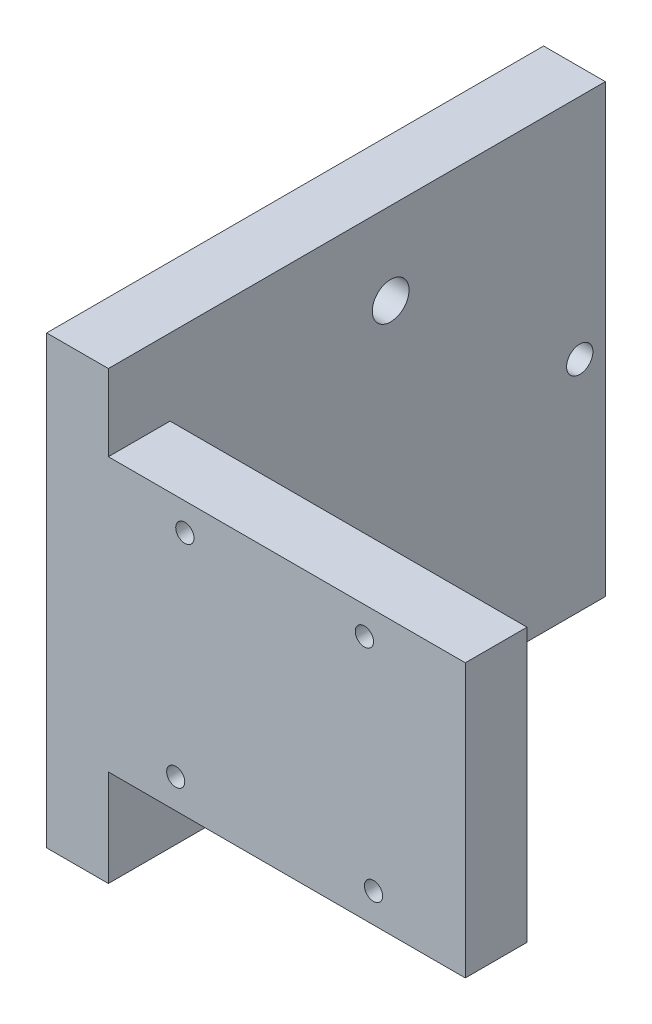
ISO-10303-21;
HEADER;
FILE_DESCRIPTION(('STEP AP214'),'2;1');
FILE_NAME('part.step','',(''),(''),'','','');
FILE_SCHEMA(('AUTOMOTIVE_DESIGN { 1 0 10303 214 1 1 1 1 }'));
ENDSEC;
DATA;
#1=APPLICATION_CONTEXT('core data for automotive mechanical design processes');
#2=APPLICATION_PROTOCOL_DEFINITION('international standard','automotive_design',2000,#1);
#3=PRODUCT_CONTEXT('',#1,'mechanical');
#4=PRODUCT('Part','Part','',(#3));
#5=PRODUCT_RELATED_PRODUCT_CATEGORY('part','',(#4));
#6=PRODUCT_DEFINITION_FORMATION('','',#4);
#7=PRODUCT_DEFINITION_CONTEXT('part definition',#1,'design');
#8=PRODUCT_DEFINITION('design','',#6,#7);
#9=PRODUCT_DEFINITION_SHAPE('','',#8);
#10=(LENGTH_UNIT() NAMED_UNIT(*) SI_UNIT(.MILLI.,.METRE.));
#11=(NAMED_UNIT(*) PLANE_ANGLE_UNIT() SI_UNIT($,.RADIAN.));
#12=(NAMED_UNIT(*) SI_UNIT($,.STERADIAN.) SOLID_ANGLE_UNIT());
#13=UNCERTAINTY_MEASURE_WITH_UNIT(LENGTH_MEASURE(1.E-05),#10,'distance_accuracy_value','');
#14=(GEOMETRIC_REPRESENTATION_CONTEXT(3) GLOBAL_UNCERTAINTY_ASSIGNED_CONTEXT((#13)) GLOBAL_UNIT_ASSIGNED_CONTEXT((#10,
#11,#12)) REPRESENTATION_CONTEXT('',''));
#15=CARTESIAN_POINT('',(0.,0.,0.));
#16=DIRECTION('',(0.,0.,1.));
#17=DIRECTION('',(1.,0.,0.));
#18=AXIS2_PLACEMENT_3D('',#15,#16,#17);
#19=CARTESIAN_POINT('',(0.,22.,24.5124364563846));
#20=DIRECTION('',(0.,0.,-1.));
#21=DIRECTION('',(-1.,0.,0.));
#22=AXIS2_PLACEMENT_3D('',#19,#20,#21);
#23=PLANE('',#22);
#24=CARTESIAN_POINT('',(3.32185507699023,6.22355655064786,24.5124364563846));
#25=DIRECTION('',(0.,0.,1.));
#26=DIRECTION('',(1.,0.,0.));
#27=AXIS2_PLACEMENT_3D('',#24,#25,#26);
#28=CIRCLE('',#27,0.44585595260604);
#29=CARTESIAN_POINT('',(3.76771102959627,6.22355655064786,24.5124364563846));
#30=VERTEX_POINT('',#29);
#31=EDGE_CURVE('E189',#30,#30,#28,.T.);
#32=ORIENTED_EDGE('',*,*,#31,.F.);
#33=EDGE_LOOP('',(#32));
#34=FACE_BOUND('',#33,.T.);
#35=CARTESIAN_POINT('',(13.0789049854493,6.22355655064786,24.5124364563846));
#36=DIRECTION('',(0.,0.,1.));
#37=DIRECTION('',(1.,0.,0.));
#38=AXIS2_PLACEMENT_3D('',#35,#36,#37);
#39=CIRCLE('',#38,0.449707116052006);
#40=CARTESIAN_POINT('',(13.5286121015013,6.22355655064786,24.5124364563846));
#41=VERTEX_POINT('',#40);
#42=EDGE_CURVE('E195',#41,#41,#39,.T.);
#43=ORIENTED_EDGE('',*,*,#42,.F.);
#44=EDGE_LOOP('',(#43));
#45=FACE_BOUND('',#44,.T.);
#46=CARTESIAN_POINT('',(12.6280672922064,16.868201952061,24.5124364563846));
#47=DIRECTION('',(0.,0.,1.));
#48=DIRECTION('',(1.,0.,0.));
#49=AXIS2_PLACEMENT_3D('',#46,#47,#48);
#50=CIRCLE('',#49,0.45083769324284);
#51=CARTESIAN_POINT('',(13.0789049854493,16.868201952061,24.5124364563846));
#52=VERTEX_POINT('',#51);
#53=EDGE_CURVE('E190',#52,#52,#50,.T.);
#54=ORIENTED_EDGE('',*,*,#53,.F.);
#55=EDGE_LOOP('',(#54));
#56=FACE_BOUND('',#55,.T.);
#57=CARTESIAN_POINT('',(3.77269277023307,16.868201952061,24.5124364563846));
#58=DIRECTION('',(0.,0.,1.));
#59=DIRECTION('',(1.,0.,0.));
#60=AXIS2_PLACEMENT_3D('',#57,#58,#59);
#61=CIRCLE('',#60,0.450837693242839);
#62=CARTESIAN_POINT('',(4.22353046347591,16.868201952061,24.5124364563846));
#63=VERTEX_POINT('',#62);
#64=EDGE_CURVE('E194',#63,#63,#61,.T.);
#65=ORIENTED_EDGE('',*,*,#64,.F.);
#66=EDGE_LOOP('',(#65));
#67=FACE_BOUND('',#66,.T.);
#68=DIRECTION('',(0.,-1.,0.));
#69=VECTOR('',#68,1.);
#70=CARTESIAN_POINT('',(0.,22.,24.5124364563846));
#71=LINE('',#70,#69);
#72=CARTESIAN_POINT('',(0.,22.,24.5124364563846));
#73=VERTEX_POINT('',#72);
#74=CARTESIAN_POINT('',(0.,18.2329000804475,24.5124364563846));
#75=VERTEX_POINT('',#74);
#76=EDGE_CURVE('E136',#73,#75,#71,.T.);
#77=ORIENTED_EDGE('',*,*,#76,.F.);
#78=DIRECTION('',(1.,0.,0.));
#79=VECTOR('',#78,1.);
#80=CARTESIAN_POINT('',(0.,22.,24.5124364563846));
#81=LINE('',#80,#79);
#82=CARTESIAN_POINT('',(-3.04359194622278,22.,24.5124364563846));
#83=VERTEX_POINT('',#82);
#84=EDGE_CURVE('E259',#83,#73,#81,.T.);
#85=ORIENTED_EDGE('',*,*,#84,.F.);
#86=DIRECTION('',(0.,-1.,0.));
#87=VECTOR('',#86,1.);
#88=CARTESIAN_POINT('',(-3.04359194622278,22.,24.5124364563846));
#89=LINE('',#88,#87);
#90=CARTESIAN_POINT('',(-3.04359194622278,0.,24.5124364563846));
#91=VERTEX_POINT('',#90);
#92=EDGE_CURVE('E272',#83,#91,#89,.T.);
#93=ORIENTED_EDGE('',*,*,#92,.T.);
#94=DIRECTION('',(1.,0.,0.));
#95=VECTOR('',#94,1.);
#96=CARTESIAN_POINT('',(0.,0.,24.5124364563846));
#97=LINE('',#96,#95);
#98=CARTESIAN_POINT('',(0.,0.,24.5124364563846));
#99=VERTEX_POINT('',#98);
#100=EDGE_CURVE('E210',#91,#99,#97,.T.);
#101=ORIENTED_EDGE('',*,*,#100,.T.);
#102=DIRECTION('',(0.,-1.,0.));
#103=VECTOR('',#102,1.);
#104=CARTESIAN_POINT('',(0.,0.,24.5124364563846));
#105=LINE('',#104,#103);
#106=CARTESIAN_POINT('',(0.,4.76787854703597,24.5124364563846));
#107=VERTEX_POINT('',#106);
#108=EDGE_CURVE('E152',#107,#99,#105,.T.);
#109=ORIENTED_EDGE('',*,*,#108,.F.);
#110=DIRECTION('',(-1.,0.,0.));
#111=VECTOR('',#110,1.);
#112=CARTESIAN_POINT('',(0.,4.76787854703597,24.5124364563846));
#113=LINE('',#112,#111);
#114=CARTESIAN_POINT('',(17.6060455626506,4.76787854703597,24.5124364563846));
#115=VERTEX_POINT('',#114);
#116=EDGE_CURVE('E179',#115,#107,#113,.T.);
#117=ORIENTED_EDGE('',*,*,#116,.F.);
#118=DIRECTION('',(0.,-1.,0.));
#119=VECTOR('',#118,1.);
#120=CARTESIAN_POINT('',(17.6060455626506,22.,24.5124364563846));
#121=LINE('',#120,#119);
#122=CARTESIAN_POINT('',(17.6060455626506,18.2329000804475,24.5124364563846));
#123=VERTEX_POINT('',#122);
#124=EDGE_CURVE('E166',#123,#115,#121,.T.);
#125=ORIENTED_EDGE('',*,*,#124,.F.);
#126=DIRECTION('',(1.,0.,0.));
#127=VECTOR('',#126,1.);
#128=CARTESIAN_POINT('',(0.,18.2329000804475,24.5124364563846));
#129=LINE('',#128,#127);
#130=EDGE_CURVE('E151',#75,#123,#129,.T.);
#131=ORIENTED_EDGE('',*,*,#130,.F.);
#132=EDGE_LOOP('',(#77,#85,#93,#101,#109,#117,#125,#131));
#133=FACE_BOUND('',#132,.T.);
#134=ADVANCED_FACE('F45',(#34,#45,#56,#67,#133),#23,.F.);
#135=CARTESIAN_POINT('',(17.6060455626506,22.,21.4688445101618));
#136=DIRECTION('',(1.,0.,0.));
#137=DIRECTION('',(0.,0.,-1.));
#138=AXIS2_PLACEMENT_3D('',#135,#136,#137);
#139=PLANE('',#138);
#140=DIRECTION('',(0.,-1.,0.));
#141=VECTOR('',#140,1.);
#142=CARTESIAN_POINT('',(17.6060455626506,22.,21.4688445101618));
#143=LINE('',#142,#141);
#144=CARTESIAN_POINT('',(17.6060455626506,18.2329000804475,21.4688445101618));
#145=VERTEX_POINT('',#144);
#146=CARTESIAN_POINT('',(17.6060455626506,4.76787854703597,21.4688445101618));
#147=VERTEX_POINT('',#146);
#148=EDGE_CURVE('E300',#145,#147,#143,.T.);
#149=ORIENTED_EDGE('',*,*,#148,.F.);
#150=DIRECTION('',(0.,0.,-1.));
#151=VECTOR('',#150,1.);
#152=CARTESIAN_POINT('',(17.6060455626506,18.2329000804475,24.5124364563846));
#153=LINE('',#152,#151);
#154=EDGE_CURVE('E161',#123,#145,#153,.T.);
#155=ORIENTED_EDGE('',*,*,#154,.F.);
#156=ORIENTED_EDGE('',*,*,#124,.T.);
#157=DIRECTION('',(0.,0.,-1.));
#158=VECTOR('',#157,1.);
#159=CARTESIAN_POINT('',(17.6060455626506,4.76787854703597,24.5124364563846));
#160=LINE('',#159,#158);
#161=EDGE_CURVE('E172',#115,#147,#160,.T.);
#162=ORIENTED_EDGE('',*,*,#161,.T.);
#163=EDGE_LOOP('',(#149,#155,#156,#162));
#164=FACE_BOUND('',#163,.T.);
#165=ADVANCED_FACE('F335',(#164),#139,.T.);
#166=CARTESIAN_POINT('',(0.,22.,21.4688445101618));
#167=DIRECTION('',(0.,0.,-1.));
#168=DIRECTION('',(-1.,0.,0.));
#169=AXIS2_PLACEMENT_3D('',#166,#167,#168);
#170=PLANE('',#169);
#171=CARTESIAN_POINT('',(3.32185507699023,6.22355655064786,21.4688445101618));
#172=DIRECTION('',(0.,0.,-1.));
#173=DIRECTION('',(-1.,0.,0.));
#174=AXIS2_PLACEMENT_3D('',#171,#172,#173);
#175=CIRCLE('',#174,0.44585595260604);
#176=CARTESIAN_POINT('',(2.87599912438419,6.22355655064786,21.4688445101618));
#177=VERTEX_POINT('',#176);
#178=EDGE_CURVE('E48',#177,#177,#175,.F.);
#179=ORIENTED_EDGE('',*,*,#178,.T.);
#180=EDGE_LOOP('',(#179));
#181=FACE_BOUND('',#180,.T.);
#182=CARTESIAN_POINT('',(13.0789049854493,6.22355655064786,21.4688445101618));
#183=DIRECTION('',(0.,0.,-1.));
#184=DIRECTION('',(-1.,0.,0.));
#185=AXIS2_PLACEMENT_3D('',#182,#183,#184);
#186=CIRCLE('',#185,0.449707116052006);
#187=CARTESIAN_POINT('',(12.6291978693972,6.22355655064786,21.4688445101618));
#188=VERTEX_POINT('',#187);
#189=EDGE_CURVE('E314',#188,#188,#186,.F.);
#190=ORIENTED_EDGE('',*,*,#189,.T.);
#191=EDGE_LOOP('',(#190));
#192=FACE_BOUND('',#191,.T.);
#193=CARTESIAN_POINT('',(12.6280672922064,16.868201952061,21.4688445101618));
#194=DIRECTION('',(0.,0.,-1.));
#195=DIRECTION('',(-1.,0.,0.));
#196=AXIS2_PLACEMENT_3D('',#193,#194,#195);
#197=CIRCLE('',#196,0.45083769324284);
#198=CARTESIAN_POINT('',(12.1772295989636,16.868201952061,21.4688445101618));
#199=VERTEX_POINT('',#198);
#200=EDGE_CURVE('E311',#199,#199,#197,.F.);
#201=ORIENTED_EDGE('',*,*,#200,.T.);
#202=EDGE_LOOP('',(#201));
#203=FACE_BOUND('',#202,.T.);
#204=CARTESIAN_POINT('',(3.77269277023307,16.868201952061,21.4688445101618));
#205=DIRECTION('',(0.,0.,-1.));
#206=DIRECTION('',(-1.,0.,0.));
#207=AXIS2_PLACEMENT_3D('',#204,#205,#206);
#208=CIRCLE('',#207,0.450837693242839);
#209=CARTESIAN_POINT('',(3.32185507699023,16.868201952061,21.4688445101618));
#210=VERTEX_POINT('',#209);
#211=EDGE_CURVE('E205',#210,#210,#208,.F.);
#212=ORIENTED_EDGE('',*,*,#211,.T.);
#213=EDGE_LOOP('',(#212));
#214=FACE_BOUND('',#213,.T.);
#215=DIRECTION('',(0.,-1.,0.));
#216=VECTOR('',#215,1.);
#217=CARTESIAN_POINT('',(0.,22.,21.4688445101618));
#218=LINE('',#217,#216);
#219=CARTESIAN_POINT('',(0.,18.2329000804475,21.4688445101618));
#220=VERTEX_POINT('',#219);
#221=CARTESIAN_POINT('',(0.,4.76787854703597,21.4688445101618));
#222=VERTEX_POINT('',#221);
#223=EDGE_CURVE('E297',#220,#222,#218,.T.);
#224=ORIENTED_EDGE('',*,*,#223,.F.);
#225=DIRECTION('',(1.,0.,0.));
#226=VECTOR('',#225,1.);
#227=CARTESIAN_POINT('',(0.,18.2329000804475,21.4688445101618));
#228=LINE('',#227,#226);
#229=EDGE_CURVE('E158',#220,#145,#228,.T.);
#230=ORIENTED_EDGE('',*,*,#229,.T.);
#231=ORIENTED_EDGE('',*,*,#148,.T.);
#232=DIRECTION('',(-1.,0.,0.));
#233=VECTOR('',#232,1.);
#234=CARTESIAN_POINT('',(0.,4.76787854703597,21.4688445101618));
#235=LINE('',#234,#233);
#236=EDGE_CURVE('E160',#147,#222,#235,.T.);
#237=ORIENTED_EDGE('',*,*,#236,.T.);
#238=EDGE_LOOP('',(#224,#230,#231,#237));
#239=FACE_BOUND('',#238,.T.);
#240=ADVANCED_FACE('F323',(#181,#192,#203,#214,#239),#170,.T.);
#241=CARTESIAN_POINT('',(0.,22.,0.));
#242=DIRECTION('',(0.,-1.,0.));
#243=DIRECTION('',(-1.,0.,0.));
#244=AXIS2_PLACEMENT_3D('',#241,#242,#243);
#245=PLANE('',#244);
#246=ORIENTED_EDGE('',*,*,#84,.T.);
#247=DIRECTION('',(0.,0.,1.));
#248=VECTOR('',#247,1.);
#249=CARTESIAN_POINT('',(0.,22.,0.));
#250=LINE('',#249,#248);
#251=CARTESIAN_POINT('',(0.,22.,0.));
#252=VERTEX_POINT('',#251);
#253=EDGE_CURVE('E145',#252,#73,#250,.T.);
#254=ORIENTED_EDGE('',*,*,#253,.F.);
#255=DIRECTION('',(1.,0.,0.));
#256=VECTOR('',#255,1.);
#257=CARTESIAN_POINT('',(-3.04359194622278,22.,0.));
#258=LINE('',#257,#256);
#259=CARTESIAN_POINT('',(-3.04359194622278,22.,0.));
#260=VERTEX_POINT('',#259);
#261=EDGE_CURVE('E265',#260,#252,#258,.T.);
#262=ORIENTED_EDGE('',*,*,#261,.F.);
#263=DIRECTION('',(0.,0.,-1.));
#264=VECTOR('',#263,1.);
#265=CARTESIAN_POINT('',(-3.04359194622278,22.,0.));
#266=LINE('',#265,#264);
#267=EDGE_CURVE('E269',#260,#83,#266,.F.);
#268=ORIENTED_EDGE('',*,*,#267,.T.);
#269=EDGE_LOOP('',(#246,#254,#262,#268));
#270=FACE_BOUND('',#269,.T.);
#271=ADVANCED_FACE('F379',(#270),#245,.F.);
#272=CARTESIAN_POINT('',(0.,0.,0.));
#273=DIRECTION('',(0.,-1.,0.));
#274=DIRECTION('',(-1.,0.,0.));
#275=AXIS2_PLACEMENT_3D('',#272,#273,#274);
#276=PLANE('',#275);
#277=DIRECTION('',(0.,0.,1.));
#278=VECTOR('',#277,1.);
#279=CARTESIAN_POINT('',(0.,0.,0.));
#280=LINE('',#279,#278);
#281=CARTESIAN_POINT('',(0.,0.,13.1074752296887));
#282=VERTEX_POINT('',#281);
#283=EDGE_CURVE('E62',#282,#99,#280,.T.);
#284=ORIENTED_EDGE('',*,*,#283,.T.);
#285=ORIENTED_EDGE('',*,*,#100,.F.);
#286=DIRECTION('',(0.,0.,-1.));
#287=VECTOR('',#286,1.);
#288=CARTESIAN_POINT('',(-3.04359194622278,0.,0.));
#289=LINE('',#288,#287);
#290=CARTESIAN_POINT('',(-3.04359194622278,0.,13.1074752296887));
#291=VERTEX_POINT('',#290);
#292=EDGE_CURVE('E284',#291,#91,#289,.F.);
#293=ORIENTED_EDGE('',*,*,#292,.F.);
#294=DIRECTION('',(-1.,0.,0.));
#295=VECTOR('',#294,1.);
#296=CARTESIAN_POINT('',(0.,0.,13.1074752296887));
#297=LINE('',#296,#295);
#298=EDGE_CURVE('E54',#282,#291,#297,.T.);
#299=ORIENTED_EDGE('',*,*,#298,.F.);
#300=EDGE_LOOP('',(#284,#285,#293,#299));
#301=FACE_BOUND('',#300,.T.);
#302=ADVANCED_FACE('F382',(#301),#276,.T.);
#303=DIRECTION('',(1.,0.,0.));
#304=VECTOR('',#303,1.);
#305=CARTESIAN_POINT('',(0.,0.,8.07117179772687));
#306=LINE('',#305,#304);
#307=CARTESIAN_POINT('',(-3.04359194622278,0.,8.07117179772687));
#308=VERTEX_POINT('',#307);
#309=CARTESIAN_POINT('',(0.,0.,8.07117179772687));
#310=VERTEX_POINT('',#309);
#311=EDGE_CURVE('E11',#308,#310,#306,.T.);
#312=ORIENTED_EDGE('',*,*,#311,.F.);
#313=CARTESIAN_POINT('',(-3.04359194622278,0.,0.));
#314=VERTEX_POINT('',#313);
#315=EDGE_CURVE('E262',#314,#308,#289,.F.);
#316=ORIENTED_EDGE('',*,*,#315,.F.);
#317=DIRECTION('',(1.,0.,0.));
#318=VECTOR('',#317,1.);
#319=CARTESIAN_POINT('',(-3.04359194622278,0.,0.));
#320=LINE('',#319,#318);
#321=CARTESIAN_POINT('',(0.,0.,0.));
#322=VERTEX_POINT('',#321);
#323=EDGE_CURVE('E280',#314,#322,#320,.T.);
#324=ORIENTED_EDGE('',*,*,#323,.T.);
#325=EDGE_CURVE('E276',#322,#310,#280,.T.);
#326=ORIENTED_EDGE('',*,*,#325,.T.);
#327=EDGE_LOOP('',(#312,#316,#324,#326));
#328=FACE_BOUND('',#327,.T.);
#329=ADVANCED_FACE('F386',(#328),#276,.T.);
#330=CARTESIAN_POINT('',(0.,22.,0.));
#331=DIRECTION('',(1.,0.,0.));
#332=DIRECTION('',(0.,0.,-1.));
#333=AXIS2_PLACEMENT_3D('',#330,#331,#332);
#334=PLANE('',#333);
#335=CARTESIAN_POINT('',(0.,17.9381550658899,10.5893235137078));
#336=DIRECTION('',(1.,0.,0.));
#337=DIRECTION('',(0.,0.,-1.));
#338=AXIS2_PLACEMENT_3D('',#335,#336,#337);
#339=CIRCLE('',#338,0.906952967008095);
#340=CARTESIAN_POINT('',(0.,17.9381550658899,9.68237054669969));
#341=VERTEX_POINT('',#340);
#342=EDGE_CURVE('E232',#341,#341,#339,.T.);
#343=ORIENTED_EDGE('',*,*,#342,.F.);
#344=EDGE_LOOP('',(#343));
#345=FACE_BOUND('',#344,.T.);
#346=ORIENTED_EDGE('',*,*,#325,.F.);
#347=DIRECTION('',(0.,-1.,0.));
#348=VECTOR('',#347,1.);
#349=CARTESIAN_POINT('',(0.,22.,0.));
#350=LINE('',#349,#348);
#351=EDGE_CURVE('E294',#252,#322,#350,.T.);
#352=ORIENTED_EDGE('',*,*,#351,.F.);
#353=ORIENTED_EDGE('',*,*,#253,.T.);
#354=ORIENTED_EDGE('',*,*,#76,.T.);
#355=DIRECTION('',(0.,0.,-1.));
#356=VECTOR('',#355,1.);
#357=CARTESIAN_POINT('',(0.,18.2329000804475,24.5124364563846));
#358=LINE('',#357,#356);
#359=EDGE_CURVE('E142',#75,#220,#358,.T.);
#360=ORIENTED_EDGE('',*,*,#359,.T.);
#361=ORIENTED_EDGE('',*,*,#223,.T.);
#362=DIRECTION('',(0.,0.,-1.));
#363=VECTOR('',#362,1.);
#364=CARTESIAN_POINT('',(0.,4.76787854703597,24.5124364563846));
#365=LINE('',#364,#363);
#366=EDGE_CURVE('E176',#107,#222,#365,.T.);
#367=ORIENTED_EDGE('',*,*,#366,.F.);
#368=ORIENTED_EDGE('',*,*,#108,.T.);
#369=ORIENTED_EDGE('',*,*,#283,.F.);
#370=DIRECTION('',(0.,-1.,0.));
#371=VECTOR('',#370,1.);
#372=CARTESIAN_POINT('',(0.,3.67860657291708,13.1074752296887));
#373=LINE('',#372,#371);
#374=CARTESIAN_POINT('',(0.,3.67860657291708,13.1074752296887));
#375=VERTEX_POINT('',#374);
#376=EDGE_CURVE('E70',#375,#282,#373,.T.);
#377=ORIENTED_EDGE('',*,*,#376,.F.);
#378=DIRECTION('',(0.,0.,1.));
#379=VECTOR('',#378,1.);
#380=CARTESIAN_POINT('',(0.,3.67860657291708,8.07117179772687));
#381=LINE('',#380,#379);
#382=CARTESIAN_POINT('',(0.,3.67860657291708,8.07117179772687));
#383=VERTEX_POINT('',#382);
#384=EDGE_CURVE('E235',#383,#375,#381,.T.);
#385=ORIENTED_EDGE('',*,*,#384,.F.);
#386=DIRECTION('',(0.,1.,0.));
#387=VECTOR('',#386,1.);
#388=CARTESIAN_POINT('',(0.,3.67860657291708,8.07117179772687));
#389=LINE('',#388,#387);
#390=EDGE_CURVE('E223',#310,#383,#389,.T.);
#391=ORIENTED_EDGE('',*,*,#390,.F.);
#392=EDGE_LOOP('',(#346,#352,#353,#354,#360,#361,#367,#368,#369,#377,#385,#391));
#393=FACE_BOUND('',#392,.T.);
#394=CARTESIAN_POINT('',(0.,10.7716723647862,1.26150112221812));
#395=DIRECTION('',(1.,0.,0.));
#396=DIRECTION('',(0.,0.,-1.));
#397=AXIS2_PLACEMENT_3D('',#394,#395,#396);
#398=CIRCLE('',#397,0.649105381072516);
#399=CARTESIAN_POINT('',(0.,10.7716723647862,0.612395741145607));
#400=VERTEX_POINT('',#399);
#401=EDGE_CURVE('E211',#400,#400,#398,.T.);
#402=ORIENTED_EDGE('',*,*,#401,.F.);
#403=EDGE_LOOP('',(#402));
#404=FACE_BOUND('',#403,.T.);
#405=CARTESIAN_POINT('',(0.,10.7716723647862,20.0110017834768));
#406=DIRECTION('',(1.,0.,0.));
#407=DIRECTION('',(0.,0.,-1.));
#408=AXIS2_PLACEMENT_3D('',#405,#406,#407);
#409=CIRCLE('',#408,0.65234643975808);
#410=CARTESIAN_POINT('',(0.,10.7716723647862,19.3586553437187));
#411=VERTEX_POINT('',#410);
#412=EDGE_CURVE('E215',#411,#411,#409,.T.);
#413=ORIENTED_EDGE('',*,*,#412,.F.);
#414=EDGE_LOOP('',(#413));
#415=FACE_BOUND('',#414,.T.);
#416=ADVANCED_FACE('F139',(#345,#393,#404,#415),#334,.T.);
#417=CARTESIAN_POINT('',(-3.04359194622278,22.,0.));
#418=DIRECTION('',(0.,0.,-1.));
#419=DIRECTION('',(-1.,0.,0.));
#420=AXIS2_PLACEMENT_3D('',#417,#418,#419);
#421=PLANE('',#420);
#422=ORIENTED_EDGE('',*,*,#323,.F.);
#423=DIRECTION('',(0.,-1.,0.));
#424=VECTOR('',#423,1.);
#425=CARTESIAN_POINT('',(-3.04359194622278,22.,0.));
#426=LINE('',#425,#424);
#427=EDGE_CURVE('E291',#260,#314,#426,.T.);
#428=ORIENTED_EDGE('',*,*,#427,.F.);
#429=ORIENTED_EDGE('',*,*,#261,.T.);
#430=ORIENTED_EDGE('',*,*,#351,.T.);
#431=EDGE_LOOP('',(#422,#428,#429,#430));
#432=FACE_BOUND('',#431,.T.);
#433=ADVANCED_FACE('F389',(#432),#421,.T.);
#434=CARTESIAN_POINT('',(-3.04359194622278,22.,0.));
#435=DIRECTION('',(1.,0.,0.));
#436=DIRECTION('',(0.,0.,-1.));
#437=AXIS2_PLACEMENT_3D('',#434,#435,#436);
#438=PLANE('',#437);
#439=CARTESIAN_POINT('',(-3.04359194622278,10.7716723647862,1.26150112221812));
#440=DIRECTION('',(1.,0.,0.));
#441=DIRECTION('',(0.,0.,-1.));
#442=AXIS2_PLACEMENT_3D('',#439,#440,#441);
#443=CIRCLE('',#442,0.649105381072516);
#444=CARTESIAN_POINT('',(-3.04359194622278,10.7716723647862,0.612395741145607));
#445=VERTEX_POINT('',#444);
#446=EDGE_CURVE('E206',#445,#445,#443,.T.);
#447=ORIENTED_EDGE('',*,*,#446,.T.);
#448=EDGE_LOOP('',(#447));
#449=FACE_BOUND('',#448,.T.);
#450=CARTESIAN_POINT('',(-3.04359194622278,10.7716723647862,20.0110017834768));
#451=DIRECTION('',(1.,0.,0.));
#452=DIRECTION('',(0.,0.,-1.));
#453=AXIS2_PLACEMENT_3D('',#450,#451,#452);
#454=CIRCLE('',#453,0.65234643975808);
#455=CARTESIAN_POINT('',(-3.04359194622278,10.7716723647862,19.3586553437187));
#456=VERTEX_POINT('',#455);
#457=EDGE_CURVE('E219',#456,#456,#454,.T.);
#458=ORIENTED_EDGE('',*,*,#457,.T.);
#459=EDGE_LOOP('',(#458));
#460=FACE_BOUND('',#459,.T.);
#461=ORIENTED_EDGE('',*,*,#315,.T.);
#462=DIRECTION('',(0.,1.,0.));
#463=VECTOR('',#462,1.);
#464=CARTESIAN_POINT('',(-3.04359194622278,3.67860657291708,8.07117179772687));
#465=LINE('',#464,#463);
#466=CARTESIAN_POINT('',(-3.04359194622278,3.67860657291708,8.07117179772687));
#467=VERTEX_POINT('',#466);
#468=EDGE_CURVE('E236',#308,#467,#465,.T.);
#469=ORIENTED_EDGE('',*,*,#468,.T.);
#470=DIRECTION('',(0.,0.,1.));
#471=VECTOR('',#470,1.);
#472=CARTESIAN_POINT('',(-3.04359194622278,3.67860657291708,8.07117179772687));
#473=LINE('',#472,#471);
#474=CARTESIAN_POINT('',(-3.04359194622278,3.67860657291708,13.1074752296887));
#475=VERTEX_POINT('',#474);
#476=EDGE_CURVE('E245',#467,#475,#473,.T.);
#477=ORIENTED_EDGE('',*,*,#476,.T.);
#478=DIRECTION('',(0.,-1.,0.));
#479=VECTOR('',#478,1.);
#480=CARTESIAN_POINT('',(-3.04359194622278,3.67860657291708,13.1074752296887));
#481=LINE('',#480,#479);
#482=EDGE_CURVE('E228',#475,#291,#481,.T.);
#483=ORIENTED_EDGE('',*,*,#482,.T.);
#484=ORIENTED_EDGE('',*,*,#292,.T.);
#485=ORIENTED_EDGE('',*,*,#92,.F.);
#486=ORIENTED_EDGE('',*,*,#267,.F.);
#487=ORIENTED_EDGE('',*,*,#427,.T.);
#488=EDGE_LOOP('',(#461,#469,#477,#483,#484,#485,#486,#487));
#489=FACE_BOUND('',#488,.T.);
#490=CARTESIAN_POINT('',(-3.04359194622278,17.9381550658899,10.5893235137078));
#491=DIRECTION('',(1.,0.,0.));
#492=DIRECTION('',(0.,0.,-1.));
#493=AXIS2_PLACEMENT_3D('',#490,#491,#492);
#494=CIRCLE('',#493,0.906952967008095);
#495=CARTESIAN_POINT('',(-3.04359194622278,17.9381550658899,9.68237054669969));
#496=VERTEX_POINT('',#495);
#497=EDGE_CURVE('E255',#496,#496,#494,.T.);
#498=ORIENTED_EDGE('',*,*,#497,.T.);
#499=EDGE_LOOP('',(#498));
#500=FACE_BOUND('',#499,.T.);
#501=ADVANCED_FACE('F368',(#449,#460,#489,#500),#438,.F.);
#502=CARTESIAN_POINT('',(-3.04359194622278,3.67860657291708,8.07117179772687));
#503=DIRECTION('',(0.,0.,-1.));
#504=DIRECTION('',(-1.,0.,0.));
#505=AXIS2_PLACEMENT_3D('',#502,#503,#504);
#506=PLANE('',#505);
#507=ORIENTED_EDGE('',*,*,#311,.T.);
#508=ORIENTED_EDGE('',*,*,#390,.T.);
#509=DIRECTION('',(1.,0.,0.));
#510=VECTOR('',#509,1.);
#511=CARTESIAN_POINT('',(-3.04359194622278,3.67860657291708,8.07117179772687));
#512=LINE('',#511,#510);
#513=EDGE_CURVE('E224',#467,#383,#512,.T.);
#514=ORIENTED_EDGE('',*,*,#513,.F.);
#515=ORIENTED_EDGE('',*,*,#468,.F.);
#516=EDGE_LOOP('',(#507,#508,#514,#515));
#517=FACE_BOUND('',#516,.T.);
#518=ADVANCED_FACE('F364',(#517),#506,.F.);
#519=CARTESIAN_POINT('',(-3.04359194622278,3.67860657291708,13.1074752296887));
#520=DIRECTION('',(0.,0.,1.));
#521=DIRECTION('',(1.,0.,0.));
#522=AXIS2_PLACEMENT_3D('',#519,#520,#521);
#523=PLANE('',#522);
#524=ORIENTED_EDGE('',*,*,#298,.T.);
#525=ORIENTED_EDGE('',*,*,#482,.F.);
#526=DIRECTION('',(1.,0.,0.));
#527=VECTOR('',#526,1.);
#528=CARTESIAN_POINT('',(-3.04359194622278,3.67860657291708,13.1074752296887));
#529=LINE('',#528,#527);
#530=EDGE_CURVE('E229',#475,#375,#529,.T.);
#531=ORIENTED_EDGE('',*,*,#530,.T.);
#532=ORIENTED_EDGE('',*,*,#376,.T.);
#533=EDGE_LOOP('',(#524,#525,#531,#532));
#534=FACE_BOUND('',#533,.T.);
#535=ADVANCED_FACE('F367',(#534),#523,.F.);
#536=CARTESIAN_POINT('',(-3.04359194622278,3.67860657291708,8.07117179772687));
#537=DIRECTION('',(0.,1.,0.));
#538=DIRECTION('',(0.,0.,1.));
#539=AXIS2_PLACEMENT_3D('',#536,#537,#538);
#540=PLANE('',#539);
#541=ORIENTED_EDGE('',*,*,#384,.T.);
#542=ORIENTED_EDGE('',*,*,#530,.F.);
#543=ORIENTED_EDGE('',*,*,#476,.F.);
#544=ORIENTED_EDGE('',*,*,#513,.T.);
#545=EDGE_LOOP('',(#541,#542,#543,#544));
#546=FACE_BOUND('',#545,.T.);
#547=ADVANCED_FACE('F370',(#546),#540,.F.);
#548=CARTESIAN_POINT('',(-3.04359194622278,17.9381550658899,10.5893235137078));
#549=DIRECTION('',(1.,0.,0.));
#550=DIRECTION('',(0.,0.,-1.));
#551=AXIS2_PLACEMENT_3D('',#548,#549,#550);
#552=CYLINDRICAL_SURFACE('',#551,0.906952967008095);
#553=ORIENTED_EDGE('',*,*,#497,.F.);
#554=EDGE_LOOP('',(#553));
#555=FACE_BOUND('',#554,.T.);
#556=ORIENTED_EDGE('',*,*,#342,.T.);
#557=EDGE_LOOP('',(#556));
#558=FACE_BOUND('',#557,.T.);
#559=ADVANCED_FACE('F362',(#555,#558),#552,.F.);
#560=CARTESIAN_POINT('',(-3.04359194622278,10.7716723647862,20.0110017834768));
#561=DIRECTION('',(1.,0.,0.));
#562=DIRECTION('',(0.,0.,-1.));
#563=AXIS2_PLACEMENT_3D('',#560,#561,#562);
#564=CYLINDRICAL_SURFACE('',#563,0.65234643975808);
#565=ORIENTED_EDGE('',*,*,#457,.F.);
#566=EDGE_LOOP('',(#565));
#567=FACE_BOUND('',#566,.T.);
#568=ORIENTED_EDGE('',*,*,#412,.T.);
#569=EDGE_LOOP('',(#568));
#570=FACE_BOUND('',#569,.T.);
#571=ADVANCED_FACE('F354',(#567,#570),#564,.F.);
#572=CARTESIAN_POINT('',(-3.04359194622278,10.7716723647862,1.26150112221812));
#573=DIRECTION('',(1.,0.,0.));
#574=DIRECTION('',(0.,0.,-1.));
#575=AXIS2_PLACEMENT_3D('',#572,#573,#574);
#576=CYLINDRICAL_SURFACE('',#575,0.649105381072516);
#577=ORIENTED_EDGE('',*,*,#446,.F.);
#578=EDGE_LOOP('',(#577));
#579=FACE_BOUND('',#578,.T.);
#580=ORIENTED_EDGE('',*,*,#401,.T.);
#581=EDGE_LOOP('',(#580));
#582=FACE_BOUND('',#581,.T.);
#583=ADVANCED_FACE('F345',(#579,#582),#576,.F.);
#584=CARTESIAN_POINT('',(3.77269277023307,16.868201952061,24.5124364563846));
#585=DIRECTION('',(0.,0.,-1.));
#586=DIRECTION('',(-1.,0.,0.));
#587=AXIS2_PLACEMENT_3D('',#584,#585,#586);
#588=CYLINDRICAL_SURFACE('',#587,0.450837693242839);
#589=ORIENTED_EDGE('',*,*,#211,.F.);
#590=EDGE_LOOP('',(#589));
#591=FACE_BOUND('',#590,.T.);
#592=ORIENTED_EDGE('',*,*,#64,.T.);
#593=EDGE_LOOP('',(#592));
#594=FACE_BOUND('',#593,.T.);
#595=ADVANCED_FACE('F342',(#591,#594),#588,.F.);
#596=CARTESIAN_POINT('',(12.6280672922064,16.868201952061,24.5124364563846));
#597=DIRECTION('',(0.,0.,-1.));
#598=DIRECTION('',(-1.,0.,0.));
#599=AXIS2_PLACEMENT_3D('',#596,#597,#598);
#600=CYLINDRICAL_SURFACE('',#599,0.45083769324284);
#601=ORIENTED_EDGE('',*,*,#200,.F.);
#602=EDGE_LOOP('',(#601));
#603=FACE_BOUND('',#602,.T.);
#604=ORIENTED_EDGE('',*,*,#53,.T.);
#605=EDGE_LOOP('',(#604));
#606=FACE_BOUND('',#605,.T.);
#607=ADVANCED_FACE('F344',(#603,#606),#600,.F.);
#608=CARTESIAN_POINT('',(13.0789049854493,6.22355655064786,24.5124364563846));
#609=DIRECTION('',(0.,0.,-1.));
#610=DIRECTION('',(-1.,0.,0.));
#611=AXIS2_PLACEMENT_3D('',#608,#609,#610);
#612=CYLINDRICAL_SURFACE('',#611,0.449707116052006);
#613=ORIENTED_EDGE('',*,*,#189,.F.);
#614=EDGE_LOOP('',(#613));
#615=FACE_BOUND('',#614,.T.);
#616=ORIENTED_EDGE('',*,*,#42,.T.);
#617=EDGE_LOOP('',(#616));
#618=FACE_BOUND('',#617,.T.);
#619=ADVANCED_FACE('F329',(#615,#618),#612,.F.);
#620=CARTESIAN_POINT('',(3.32185507699023,6.22355655064786,24.5124364563846));
#621=DIRECTION('',(0.,0.,-1.));
#622=DIRECTION('',(-1.,0.,0.));
#623=AXIS2_PLACEMENT_3D('',#620,#621,#622);
#624=CYLINDRICAL_SURFACE('',#623,0.44585595260604);
#625=ORIENTED_EDGE('',*,*,#178,.F.);
#626=EDGE_LOOP('',(#625));
#627=FACE_BOUND('',#626,.T.);
#628=ORIENTED_EDGE('',*,*,#31,.T.);
#629=EDGE_LOOP('',(#628));
#630=FACE_BOUND('',#629,.T.);
#631=ADVANCED_FACE('F325',(#627,#630),#624,.F.);
#632=CARTESIAN_POINT('',(0.,4.76787854703597,24.5124364563846));
#633=DIRECTION('',(0.,-1.,0.));
#634=DIRECTION('',(0.,0.,-1.));
#635=AXIS2_PLACEMENT_3D('',#632,#633,#634);
#636=PLANE('',#635);
#637=ORIENTED_EDGE('',*,*,#161,.F.);
#638=ORIENTED_EDGE('',*,*,#116,.T.);
#639=ORIENTED_EDGE('',*,*,#366,.T.);
#640=ORIENTED_EDGE('',*,*,#236,.F.);
#641=EDGE_LOOP('',(#637,#638,#639,#640));
#642=FACE_BOUND('',#641,.T.);
#643=ADVANCED_FACE('F328',(#642),#636,.T.);
#644=CARTESIAN_POINT('',(0.,18.2329000804475,24.5124364563846));
#645=DIRECTION('',(0.,1.,0.));
#646=DIRECTION('',(0.,0.,1.));
#647=AXIS2_PLACEMENT_3D('',#644,#645,#646);
#648=PLANE('',#647);
#649=ORIENTED_EDGE('',*,*,#359,.F.);
#650=ORIENTED_EDGE('',*,*,#130,.T.);
#651=ORIENTED_EDGE('',*,*,#154,.T.);
#652=ORIENTED_EDGE('',*,*,#229,.F.);
#653=EDGE_LOOP('',(#649,#650,#651,#652));
#654=FACE_BOUND('',#653,.T.);
#655=ADVANCED_FACE('F155',(#654),#648,.T.);
#656=CLOSED_SHELL('',(#134,#165,#240,#271,#302,#329,#416,#433,#501,#518,#535,#547,#559,#571,
#583,#595,#607,#619,#631,#643,#655));
#657=MANIFOLD_SOLID_BREP('B2',#656);
#658=ADVANCED_BREP_SHAPE_REPRESENTATION('',(#18,#657),#14);
#659=SHAPE_DEFINITION_REPRESENTATION(#9,#658);
ENDSEC;
END-ISO-10303-21;
